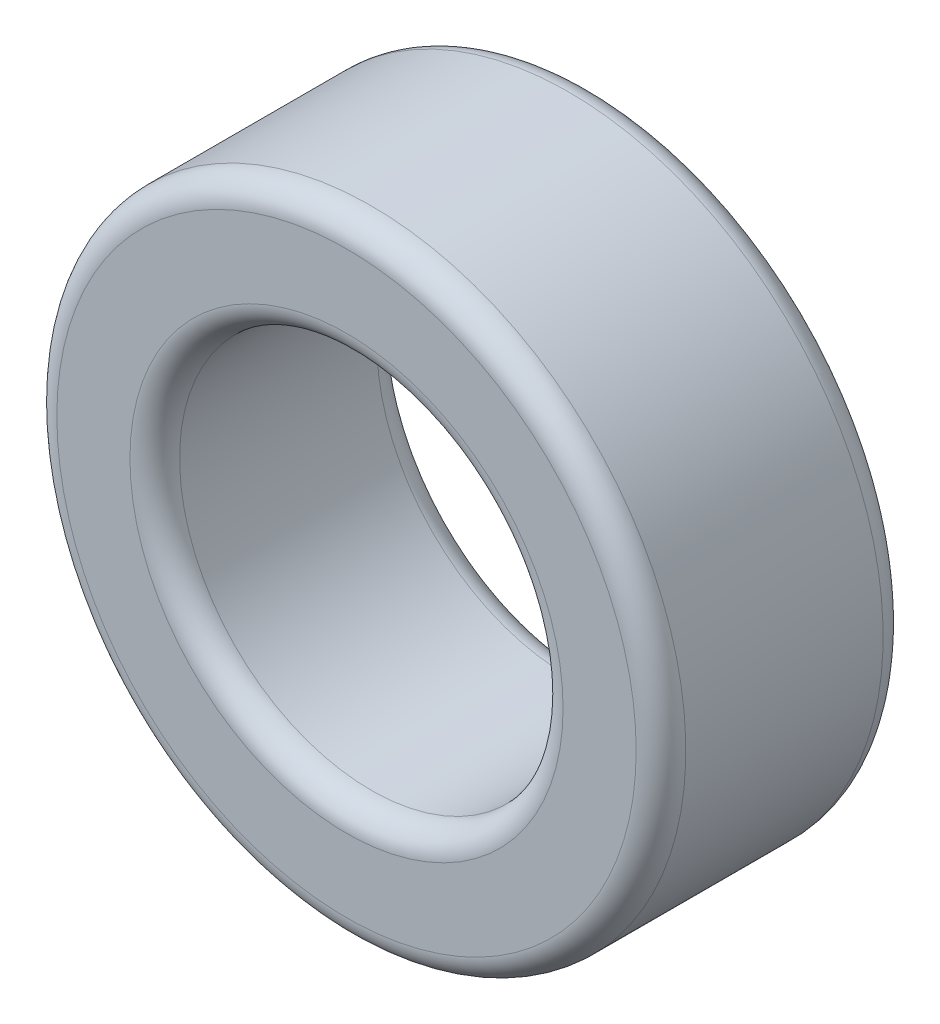
ISO-10303-21;
HEADER;
FILE_DESCRIPTION(('STEP AP214'),'2;1');
FILE_NAME('part.step','',(''),(''),'','','');
FILE_SCHEMA(('AUTOMOTIVE_DESIGN { 1 0 10303 214 1 1 1 1 }'));
ENDSEC;
DATA;
#1=APPLICATION_CONTEXT('core data for automotive mechanical design processes');
#2=APPLICATION_PROTOCOL_DEFINITION('international standard','automotive_design',2000,#1);
#3=PRODUCT_CONTEXT('',#1,'mechanical');
#4=PRODUCT('Part','Part','',(#3));
#5=PRODUCT_RELATED_PRODUCT_CATEGORY('part','',(#4));
#6=PRODUCT_DEFINITION_FORMATION('','',#4);
#7=PRODUCT_DEFINITION_CONTEXT('part definition',#1,'design');
#8=PRODUCT_DEFINITION('design','',#6,#7);
#9=PRODUCT_DEFINITION_SHAPE('','',#8);
#10=(LENGTH_UNIT() NAMED_UNIT(*) SI_UNIT(.MILLI.,.METRE.));
#11=(NAMED_UNIT(*) PLANE_ANGLE_UNIT() SI_UNIT($,.RADIAN.));
#12=(NAMED_UNIT(*) SI_UNIT($,.STERADIAN.) SOLID_ANGLE_UNIT());
#13=UNCERTAINTY_MEASURE_WITH_UNIT(LENGTH_MEASURE(1.E-05),#10,'distance_accuracy_value','');
#14=(GEOMETRIC_REPRESENTATION_CONTEXT(3) GLOBAL_UNCERTAINTY_ASSIGNED_CONTEXT((#13)) GLOBAL_UNIT_ASSIGNED_CONTEXT((#10,
#11,#12)) REPRESENTATION_CONTEXT('',''));
#15=CARTESIAN_POINT('',(0.,0.,0.));
#16=DIRECTION('',(0.,0.,1.));
#17=DIRECTION('',(1.,0.,0.));
#18=AXIS2_PLACEMENT_3D('',#15,#16,#17);
#19=CARTESIAN_POINT('',(0.,0.,4.975));
#20=DIRECTION('',(0.,0.,-1.));
#21=DIRECTION('',(-1.,0.,0.));
#22=AXIS2_PLACEMENT_3D('',#19,#20,#21);
#23=CYLINDRICAL_SURFACE('',#22,7.725);
#24=CARTESIAN_POINT('',(0.,0.,3.975));
#25=DIRECTION('',(0.,0.,1.));
#26=DIRECTION('',(1.,0.,0.));
#27=AXIS2_PLACEMENT_3D('',#24,#25,#26);
#28=CIRCLE('',#27,7.725);
#29=CARTESIAN_POINT('',(7.725,0.,3.975));
#30=VERTEX_POINT('',#29);
#31=EDGE_CURVE('E217',#30,#30,#28,.F.);
#32=ORIENTED_EDGE('',*,*,#31,.F.);
#33=EDGE_LOOP('',(#32));
#34=FACE_BOUND('',#33,.T.);
#35=CARTESIAN_POINT('',(0.,0.,-3.975));
#36=DIRECTION('',(0.,0.,1.));
#37=DIRECTION('',(1.,0.,0.));
#38=AXIS2_PLACEMENT_3D('',#35,#36,#37);
#39=CIRCLE('',#38,7.725);
#40=CARTESIAN_POINT('',(7.725,0.,-3.975));
#41=VERTEX_POINT('',#40);
#42=EDGE_CURVE('E68',#41,#41,#39,.T.);
#43=ORIENTED_EDGE('',*,*,#42,.F.);
#44=EDGE_LOOP('',(#43));
#45=FACE_BOUND('',#44,.T.);
#46=ADVANCED_FACE('F17',(#34,#45),#23,.F.);
#47=CARTESIAN_POINT('',(0.,0.,3.975));
#48=DIRECTION('',(0.,0.,1.));
#49=DIRECTION('',(1.,0.,0.));
#50=AXIS2_PLACEMENT_3D('',#47,#48,#49);
#51=TOROIDAL_SURFACE('',#50,8.725,1.);
#52=ORIENTED_EDGE('',*,*,#31,.T.);
#53=EDGE_LOOP('',(#52));
#54=FACE_BOUND('',#53,.T.);
#55=CARTESIAN_POINT('',(0.,0.,4.975));
#56=DIRECTION('',(0.,0.,1.));
#57=DIRECTION('',(1.,0.,0.));
#58=AXIS2_PLACEMENT_3D('',#55,#56,#57);
#59=CIRCLE('',#58,8.725);
#60=CARTESIAN_POINT('',(-8.725,0.,4.975));
#61=VERTEX_POINT('',#60);
#62=CARTESIAN_POINT('',(8.725,0.,4.975));
#63=VERTEX_POINT('',#62);
#64=EDGE_CURVE('E58',#61,#63,#59,.F.);
#65=ORIENTED_EDGE('',*,*,#64,.F.);
#66=CARTESIAN_POINT('',(0.,0.,4.975));
#67=DIRECTION('',(0.,0.,1.));
#68=DIRECTION('',(-1.,0.,0.));
#69=AXIS2_PLACEMENT_3D('',#66,#67,#68);
#70=CIRCLE('',#69,8.725);
#71=EDGE_CURVE('E56',#63,#61,#70,.F.);
#72=ORIENTED_EDGE('',*,*,#71,.F.);
#73=EDGE_LOOP('',(#65,#72));
#74=FACE_BOUND('',#73,.T.);
#75=ADVANCED_FACE('F60',(#54,#74),#51,.T.);
#76=CARTESIAN_POINT('',(0.,0.,-3.975));
#77=DIRECTION('',(0.,0.,1.));
#78=DIRECTION('',(1.,0.,0.));
#79=AXIS2_PLACEMENT_3D('',#76,#77,#78);
#80=TOROIDAL_SURFACE('',#79,8.725,1.);
#81=CARTESIAN_POINT('',(0.,0.,-4.975));
#82=DIRECTION('',(0.,0.,-1.));
#83=DIRECTION('',(1.,0.,0.));
#84=AXIS2_PLACEMENT_3D('',#81,#82,#83);
#85=CIRCLE('',#84,8.725);
#86=CARTESIAN_POINT('',(8.725,0.,-4.975));
#87=VERTEX_POINT('',#86);
#88=CARTESIAN_POINT('',(-8.725,0.,-4.975));
#89=VERTEX_POINT('',#88);
#90=EDGE_CURVE('E63',#87,#89,#85,.T.);
#91=ORIENTED_EDGE('',*,*,#90,.T.);
#92=CARTESIAN_POINT('',(0.,0.,-4.975));
#93=DIRECTION('',(0.,0.,-1.));
#94=DIRECTION('',(-1.,0.,0.));
#95=AXIS2_PLACEMENT_3D('',#92,#93,#94);
#96=CIRCLE('',#95,8.725);
#97=EDGE_CURVE('E158',#89,#87,#96,.T.);
#98=ORIENTED_EDGE('',*,*,#97,.T.);
#99=EDGE_LOOP('',(#91,#98));
#100=FACE_BOUND('',#99,.T.);
#101=ORIENTED_EDGE('',*,*,#42,.T.);
#102=EDGE_LOOP('',(#101));
#103=FACE_BOUND('',#102,.T.);
#104=ADVANCED_FACE('F89',(#100,#103),#80,.T.);
#105=CARTESIAN_POINT('',(0.,0.,4.975));
#106=DIRECTION('',(0.,0.,1.));
#107=DIRECTION('',(1.,0.,0.));
#108=AXIS2_PLACEMENT_3D('',#105,#106,#107);
#109=PLANE('',#108);
#110=CARTESIAN_POINT('',(0.,0.,4.975));
#111=DIRECTION('',(0.,0.,-1.));
#112=DIRECTION('',(-1.,0.,0.));
#113=AXIS2_PLACEMENT_3D('',#110,#111,#112);
#114=CIRCLE('',#113,11.67);
#115=CARTESIAN_POINT('',(-11.67,0.,4.975));
#116=VERTEX_POINT('',#115);
#117=CARTESIAN_POINT('',(11.67,0.,4.975));
#118=VERTEX_POINT('',#117);
#119=EDGE_CURVE('E124',#116,#118,#114,.T.);
#120=ORIENTED_EDGE('',*,*,#119,.F.);
#121=CARTESIAN_POINT('',(0.,0.,4.975));
#122=DIRECTION('',(0.,0.,-1.));
#123=DIRECTION('',(1.,0.,0.));
#124=AXIS2_PLACEMENT_3D('',#121,#122,#123);
#125=CIRCLE('',#124,11.67);
#126=EDGE_CURVE('E112',#118,#116,#125,.T.);
#127=ORIENTED_EDGE('',*,*,#126,.F.);
#128=EDGE_LOOP('',(#120,#127));
#129=FACE_BOUND('',#128,.T.);
#130=ORIENTED_EDGE('',*,*,#71,.T.);
#131=ORIENTED_EDGE('',*,*,#64,.T.);
#132=EDGE_LOOP('',(#130,#131));
#133=FACE_BOUND('',#132,.T.);
#134=ADVANCED_FACE('F67',(#129,#133),#109,.T.);
#135=CARTESIAN_POINT('',(0.,0.,-4.975));
#136=DIRECTION('',(0.,0.,1.));
#137=DIRECTION('',(1.,0.,0.));
#138=AXIS2_PLACEMENT_3D('',#135,#136,#137);
#139=PLANE('',#138);
#140=CARTESIAN_POINT('',(0.,0.,-4.975));
#141=DIRECTION('',(0.,0.,1.));
#142=DIRECTION('',(1.,0.,0.));
#143=AXIS2_PLACEMENT_3D('',#140,#141,#142);
#144=CIRCLE('',#143,11.67);
#145=CARTESIAN_POINT('',(11.67,0.,-4.975));
#146=VERTEX_POINT('',#145);
#147=CARTESIAN_POINT('',(-11.67,0.,-4.975));
#148=VERTEX_POINT('',#147);
#149=EDGE_CURVE('E168',#146,#148,#144,.T.);
#150=ORIENTED_EDGE('',*,*,#149,.F.);
#151=CARTESIAN_POINT('',(0.,0.,-4.975));
#152=DIRECTION('',(0.,0.,1.));
#153=DIRECTION('',(-1.,0.,0.));
#154=AXIS2_PLACEMENT_3D('',#151,#152,#153);
#155=CIRCLE('',#154,11.67);
#156=EDGE_CURVE('E35',#148,#146,#155,.T.);
#157=ORIENTED_EDGE('',*,*,#156,.F.);
#158=EDGE_LOOP('',(#150,#157));
#159=FACE_BOUND('',#158,.T.);
#160=ORIENTED_EDGE('',*,*,#90,.F.);
#161=ORIENTED_EDGE('',*,*,#97,.F.);
#162=EDGE_LOOP('',(#160,#161));
#163=FACE_BOUND('',#162,.T.);
#164=ADVANCED_FACE('F88',(#159,#163),#139,.F.);
#165=CARTESIAN_POINT('',(0.,0.,3.975));
#166=DIRECTION('',(0.,0.,1.));
#167=DIRECTION('',(1.,0.,0.));
#168=AXIS2_PLACEMENT_3D('',#165,#166,#167);
#169=TOROIDAL_SURFACE('',#168,11.67,1.);
#170=ORIENTED_EDGE('',*,*,#126,.T.);
#171=ORIENTED_EDGE('',*,*,#119,.T.);
#172=EDGE_LOOP('',(#170,#171));
#173=FACE_BOUND('',#172,.T.);
#174=CARTESIAN_POINT('',(0.,0.,3.975));
#175=DIRECTION('',(0.,0.,-1.));
#176=DIRECTION('',(-1.,0.,0.));
#177=AXIS2_PLACEMENT_3D('',#174,#175,#176);
#178=CIRCLE('',#177,12.67);
#179=CARTESIAN_POINT('',(-12.67,0.,3.975));
#180=VERTEX_POINT('',#179);
#181=EDGE_CURVE('E27',#180,#180,#178,.T.);
#182=ORIENTED_EDGE('',*,*,#181,.F.);
#183=EDGE_LOOP('',(#182));
#184=FACE_BOUND('',#183,.T.);
#185=ADVANCED_FACE('F128',(#173,#184),#169,.T.);
#186=CARTESIAN_POINT('',(0.,0.,-3.975));
#187=DIRECTION('',(0.,0.,1.));
#188=DIRECTION('',(1.,0.,0.));
#189=AXIS2_PLACEMENT_3D('',#186,#187,#188);
#190=TOROIDAL_SURFACE('',#189,11.67,1.);
#191=CARTESIAN_POINT('',(0.,0.,-3.975));
#192=DIRECTION('',(0.,0.,-1.));
#193=DIRECTION('',(-1.,0.,0.));
#194=AXIS2_PLACEMENT_3D('',#191,#192,#193);
#195=CIRCLE('',#194,12.67);
#196=CARTESIAN_POINT('',(-12.67,0.,-3.975));
#197=VERTEX_POINT('',#196);
#198=EDGE_CURVE('E11',#197,#197,#195,.F.);
#199=ORIENTED_EDGE('',*,*,#198,.F.);
#200=EDGE_LOOP('',(#199));
#201=FACE_BOUND('',#200,.T.);
#202=ORIENTED_EDGE('',*,*,#149,.T.);
#203=ORIENTED_EDGE('',*,*,#156,.T.);
#204=EDGE_LOOP('',(#202,#203));
#205=FACE_BOUND('',#204,.T.);
#206=ADVANCED_FACE('F137',(#201,#205),#190,.T.);
#207=CARTESIAN_POINT('',(0.,0.,4.975));
#208=DIRECTION('',(0.,0.,-1.));
#209=DIRECTION('',(-1.,0.,0.));
#210=AXIS2_PLACEMENT_3D('',#207,#208,#209);
#211=CYLINDRICAL_SURFACE('',#210,12.67);
#212=ORIENTED_EDGE('',*,*,#198,.T.);
#213=EDGE_LOOP('',(#212));
#214=FACE_BOUND('',#213,.T.);
#215=ORIENTED_EDGE('',*,*,#181,.T.);
#216=EDGE_LOOP('',(#215));
#217=FACE_BOUND('',#216,.T.);
#218=ADVANCED_FACE('F248',(#214,#217),#211,.T.);
#219=CLOSED_SHELL('',(#46,#75,#104,#134,#164,#185,#206,#218));
#220=MANIFOLD_SOLID_BREP('B1',#219);
#221=ADVANCED_BREP_SHAPE_REPRESENTATION('',(#18,#220),#14);
#222=SHAPE_DEFINITION_REPRESENTATION(#9,#221);
ENDSEC;
END-ISO-10303-21;
